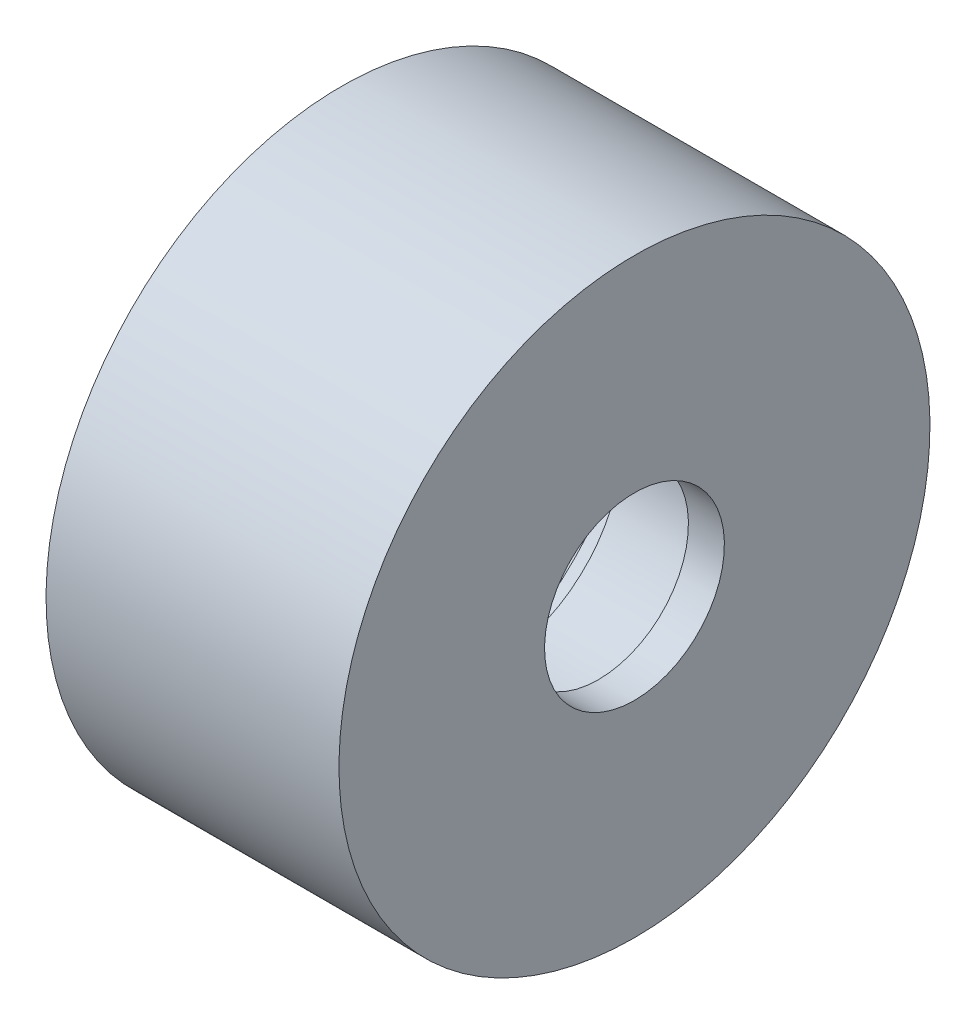
ISO-10303-21;
HEADER;
FILE_DESCRIPTION(('STEP AP214'),'2;1');
FILE_NAME('part.step','',(''),(''),'','','');
FILE_SCHEMA(('AUTOMOTIVE_DESIGN { 1 0 10303 214 1 1 1 1 }'));
ENDSEC;
DATA;
#1=APPLICATION_CONTEXT('core data for automotive mechanical design processes');
#2=APPLICATION_PROTOCOL_DEFINITION('international standard','automotive_design',2000,#1);
#3=PRODUCT_CONTEXT('',#1,'mechanical');
#4=PRODUCT('Part','Part','',(#3));
#5=PRODUCT_RELATED_PRODUCT_CATEGORY('part','',(#4));
#6=PRODUCT_DEFINITION_FORMATION('','',#4);
#7=PRODUCT_DEFINITION_CONTEXT('part definition',#1,'design');
#8=PRODUCT_DEFINITION('design','',#6,#7);
#9=PRODUCT_DEFINITION_SHAPE('','',#8);
#10=(LENGTH_UNIT() NAMED_UNIT(*) SI_UNIT(.MILLI.,.METRE.));
#11=(NAMED_UNIT(*) PLANE_ANGLE_UNIT() SI_UNIT($,.RADIAN.));
#12=(NAMED_UNIT(*) SI_UNIT($,.STERADIAN.) SOLID_ANGLE_UNIT());
#13=UNCERTAINTY_MEASURE_WITH_UNIT(LENGTH_MEASURE(1.E-05),#10,'distance_accuracy_value','');
#14=(GEOMETRIC_REPRESENTATION_CONTEXT(3) GLOBAL_UNCERTAINTY_ASSIGNED_CONTEXT((#13)) GLOBAL_UNIT_ASSIGNED_CONTEXT((#10,
#11,#12)) REPRESENTATION_CONTEXT('',''));
#15=CARTESIAN_POINT('',(0.,0.,0.));
#16=DIRECTION('',(0.,0.,1.));
#17=DIRECTION('',(1.,0.,0.));
#18=AXIS2_PLACEMENT_3D('',#15,#16,#17);
#19=CARTESIAN_POINT('',(-19.1835123598581,2.5,0.));
#20=DIRECTION('',(-1.,0.,0.));
#21=DIRECTION('',(0.,-1.,0.));
#22=AXIS2_PLACEMENT_3D('',#19,#20,#21);
#23=CYLINDRICAL_SURFACE('',#22,3.5);
#24=CARTESIAN_POINT('',(-11.6,2.5,0.));
#25=DIRECTION('',(-1.,0.,0.));
#26=DIRECTION('',(0.,-1.,0.));
#27=AXIS2_PLACEMENT_3D('',#24,#25,#26);
#28=CIRCLE('',#27,3.5);
#29=CARTESIAN_POINT('',(-11.6,-0.999999999999998,0.));
#30=VERTEX_POINT('',#29);
#31=EDGE_CURVE('E10',#30,#30,#28,.T.);
#32=ORIENTED_EDGE('',*,*,#31,.F.);
#33=EDGE_LOOP('',(#32));
#34=FACE_BOUND('',#33,.T.);
#35=CARTESIAN_POINT('',(-13.,2.5,0.));
#36=DIRECTION('',(-1.,0.,0.));
#37=DIRECTION('',(0.,-1.,0.));
#38=AXIS2_PLACEMENT_3D('',#35,#36,#37);
#39=CIRCLE('',#38,3.5);
#40=CARTESIAN_POINT('',(-13.,-0.999999999999998,0.));
#41=VERTEX_POINT('',#40);
#42=EDGE_CURVE('E67',#41,#41,#39,.T.);
#43=ORIENTED_EDGE('',*,*,#42,.T.);
#44=EDGE_LOOP('',(#43));
#45=FACE_BOUND('',#44,.T.);
#46=ADVANCED_FACE('F33',(#34,#45),#23,.F.);
#47=CARTESIAN_POINT('',(-11.6,6.,0.));
#48=DIRECTION('',(-1.,0.,0.));
#49=DIRECTION('',(0.,-1.,0.));
#50=AXIS2_PLACEMENT_3D('',#47,#48,#49);
#51=PLANE('',#50);
#52=CARTESIAN_POINT('',(-11.6,2.5,0.));
#53=DIRECTION('',(-1.,0.,0.));
#54=DIRECTION('',(0.,-1.,0.));
#55=AXIS2_PLACEMENT_3D('',#52,#53,#54);
#56=CIRCLE('',#55,11.5);
#57=CARTESIAN_POINT('',(-11.6,-9.,0.));
#58=VERTEX_POINT('',#57);
#59=EDGE_CURVE('E39',#58,#58,#56,.T.);
#60=ORIENTED_EDGE('',*,*,#59,.F.);
#61=EDGE_LOOP('',(#60));
#62=FACE_BOUND('',#61,.T.);
#63=ORIENTED_EDGE('',*,*,#31,.T.);
#64=EDGE_LOOP('',(#63));
#65=FACE_BOUND('',#64,.T.);
#66=ADVANCED_FACE('F116',(#62,#65),#51,.F.);
#67=CARTESIAN_POINT('',(-19.1835123598581,2.5,0.));
#68=DIRECTION('',(-1.,0.,0.));
#69=DIRECTION('',(0.,-1.,0.));
#70=AXIS2_PLACEMENT_3D('',#67,#68,#69);
#71=CYLINDRICAL_SURFACE('',#70,11.5);
#72=CARTESIAN_POINT('',(-23.,2.5,0.));
#73=DIRECTION('',(-1.,0.,0.));
#74=DIRECTION('',(0.,-1.,0.));
#75=AXIS2_PLACEMENT_3D('',#72,#73,#74);
#76=CIRCLE('',#75,11.5);
#77=CARTESIAN_POINT('',(-23.,-9.,0.));
#78=VERTEX_POINT('',#77);
#79=EDGE_CURVE('E43',#78,#78,#76,.T.);
#80=ORIENTED_EDGE('',*,*,#79,.F.);
#81=EDGE_LOOP('',(#80));
#82=FACE_BOUND('',#81,.T.);
#83=ORIENTED_EDGE('',*,*,#59,.T.);
#84=EDGE_LOOP('',(#83));
#85=FACE_BOUND('',#84,.T.);
#86=ADVANCED_FACE('F111',(#82,#85),#71,.T.);
#87=CARTESIAN_POINT('',(-23.,12.,0.));
#88=DIRECTION('',(1.,0.,0.));
#89=DIRECTION('',(0.,1.,0.));
#90=AXIS2_PLACEMENT_3D('',#87,#88,#89);
#91=PLANE('',#90);
#92=CARTESIAN_POINT('',(-23.,2.5,0.));
#93=DIRECTION('',(-1.,0.,0.));
#94=DIRECTION('',(0.,-1.,0.));
#95=AXIS2_PLACEMENT_3D('',#92,#93,#94);
#96=CIRCLE('',#95,9.5);
#97=CARTESIAN_POINT('',(-23.,-7.,0.));
#98=VERTEX_POINT('',#97);
#99=EDGE_CURVE('E47',#98,#98,#96,.T.);
#100=ORIENTED_EDGE('',*,*,#99,.F.);
#101=EDGE_LOOP('',(#100));
#102=FACE_BOUND('',#101,.T.);
#103=ORIENTED_EDGE('',*,*,#79,.T.);
#104=EDGE_LOOP('',(#103));
#105=FACE_BOUND('',#104,.T.);
#106=ADVANCED_FACE('F105',(#102,#105),#91,.F.);
#107=CARTESIAN_POINT('',(-23.,2.5,0.));
#108=DIRECTION('',(1.,0.,0.));
#109=DIRECTION('',(0.,1.,0.));
#110=AXIS2_PLACEMENT_3D('',#107,#108,#109);
#111=CONICAL_SURFACE('',#110,9.5,0.321750554396642);
#112=CARTESIAN_POINT('',(-20.,2.5,0.));
#113=DIRECTION('',(-1.,0.,0.));
#114=DIRECTION('',(0.,-1.,0.));
#115=AXIS2_PLACEMENT_3D('',#112,#113,#114);
#116=CIRCLE('',#115,10.5);
#117=CARTESIAN_POINT('',(-20.,-8.,0.));
#118=VERTEX_POINT('',#117);
#119=EDGE_CURVE('E52',#118,#118,#116,.T.);
#120=ORIENTED_EDGE('',*,*,#119,.F.);
#121=EDGE_LOOP('',(#120));
#122=FACE_BOUND('',#121,.T.);
#123=ORIENTED_EDGE('',*,*,#99,.T.);
#124=EDGE_LOOP('',(#123));
#125=FACE_BOUND('',#124,.T.);
#126=ADVANCED_FACE('F99',(#122,#125),#111,.F.);
#127=CARTESIAN_POINT('',(-20.,11.,0.));
#128=DIRECTION('',(1.,0.,0.));
#129=DIRECTION('',(0.,1.,0.));
#130=AXIS2_PLACEMENT_3D('',#127,#128,#129);
#131=PLANE('',#130);
#132=CARTESIAN_POINT('',(-20.,2.5,0.));
#133=DIRECTION('',(-1.,0.,0.));
#134=DIRECTION('',(0.,-1.,0.));
#135=AXIS2_PLACEMENT_3D('',#132,#133,#134);
#136=CIRCLE('',#135,8.5);
#137=CARTESIAN_POINT('',(-20.,-6.,0.));
#138=VERTEX_POINT('',#137);
#139=EDGE_CURVE('E55',#138,#138,#136,.T.);
#140=ORIENTED_EDGE('',*,*,#139,.F.);
#141=EDGE_LOOP('',(#140));
#142=FACE_BOUND('',#141,.T.);
#143=ORIENTED_EDGE('',*,*,#119,.T.);
#144=EDGE_LOOP('',(#143));
#145=FACE_BOUND('',#144,.T.);
#146=ADVANCED_FACE('F93',(#142,#145),#131,.F.);
#147=CARTESIAN_POINT('',(-19.1835123598581,2.5,0.));
#148=DIRECTION('',(-1.,0.,0.));
#149=DIRECTION('',(0.,-1.,0.));
#150=AXIS2_PLACEMENT_3D('',#147,#148,#149);
#151=CYLINDRICAL_SURFACE('',#150,8.5);
#152=CARTESIAN_POINT('',(-17.,2.5,0.));
#153=DIRECTION('',(-1.,0.,0.));
#154=DIRECTION('',(0.,-1.,0.));
#155=AXIS2_PLACEMENT_3D('',#152,#153,#154);
#156=CIRCLE('',#155,8.5);
#157=CARTESIAN_POINT('',(-17.,-6.,0.));
#158=VERTEX_POINT('',#157);
#159=EDGE_CURVE('E58',#158,#158,#156,.T.);
#160=ORIENTED_EDGE('',*,*,#159,.F.);
#161=EDGE_LOOP('',(#160));
#162=FACE_BOUND('',#161,.T.);
#163=ORIENTED_EDGE('',*,*,#139,.T.);
#164=EDGE_LOOP('',(#163));
#165=FACE_BOUND('',#164,.T.);
#166=ADVANCED_FACE('F87',(#162,#165),#151,.F.);
#167=CARTESIAN_POINT('',(-17.,7.4,0.));
#168=DIRECTION('',(1.,0.,0.));
#169=DIRECTION('',(0.,1.,0.));
#170=AXIS2_PLACEMENT_3D('',#167,#168,#169);
#171=PLANE('',#170);
#172=CARTESIAN_POINT('',(-17.,2.5,0.));
#173=DIRECTION('',(-1.,0.,0.));
#174=DIRECTION('',(0.,-1.,0.));
#175=AXIS2_PLACEMENT_3D('',#172,#173,#174);
#176=CIRCLE('',#175,4.9);
#177=CARTESIAN_POINT('',(-17.,-2.4,0.));
#178=VERTEX_POINT('',#177);
#179=EDGE_CURVE('E61',#178,#178,#176,.T.);
#180=ORIENTED_EDGE('',*,*,#179,.F.);
#181=EDGE_LOOP('',(#180));
#182=FACE_BOUND('',#181,.T.);
#183=ORIENTED_EDGE('',*,*,#159,.T.);
#184=EDGE_LOOP('',(#183));
#185=FACE_BOUND('',#184,.T.);
#186=ADVANCED_FACE('F81',(#182,#185),#171,.F.);
#187=CARTESIAN_POINT('',(-19.1835123598581,2.5,0.));
#188=DIRECTION('',(-1.,0.,0.));
#189=DIRECTION('',(0.,-1.,0.));
#190=AXIS2_PLACEMENT_3D('',#187,#188,#189);
#191=CYLINDRICAL_SURFACE('',#190,4.9);
#192=CARTESIAN_POINT('',(-13.,2.5,0.));
#193=DIRECTION('',(-1.,0.,0.));
#194=DIRECTION('',(0.,-1.,0.));
#195=AXIS2_PLACEMENT_3D('',#192,#193,#194);
#196=CIRCLE('',#195,4.9);
#197=CARTESIAN_POINT('',(-13.,-2.4,0.));
#198=VERTEX_POINT('',#197);
#199=EDGE_CURVE('E64',#198,#198,#196,.T.);
#200=ORIENTED_EDGE('',*,*,#199,.F.);
#201=EDGE_LOOP('',(#200));
#202=FACE_BOUND('',#201,.T.);
#203=ORIENTED_EDGE('',*,*,#179,.T.);
#204=EDGE_LOOP('',(#203));
#205=FACE_BOUND('',#204,.T.);
#206=ADVANCED_FACE('F75',(#202,#205),#191,.F.);
#207=CARTESIAN_POINT('',(-13.,6.,0.));
#208=DIRECTION('',(1.,0.,0.));
#209=DIRECTION('',(0.,1.,0.));
#210=AXIS2_PLACEMENT_3D('',#207,#208,#209);
#211=PLANE('',#210);
#212=ORIENTED_EDGE('',*,*,#42,.F.);
#213=EDGE_LOOP('',(#212));
#214=FACE_BOUND('',#213,.T.);
#215=ORIENTED_EDGE('',*,*,#199,.T.);
#216=EDGE_LOOP('',(#215));
#217=FACE_BOUND('',#216,.T.);
#218=ADVANCED_FACE('F72',(#214,#217),#211,.F.);
#219=CLOSED_SHELL('',(#46,#66,#86,#106,#126,#146,#166,#186,#206,#218));
#220=MANIFOLD_SOLID_BREP('B2',#219);
#221=ADVANCED_BREP_SHAPE_REPRESENTATION('',(#18,#220),#14);
#222=SHAPE_DEFINITION_REPRESENTATION(#9,#221);
ENDSEC;
END-ISO-10303-21;
